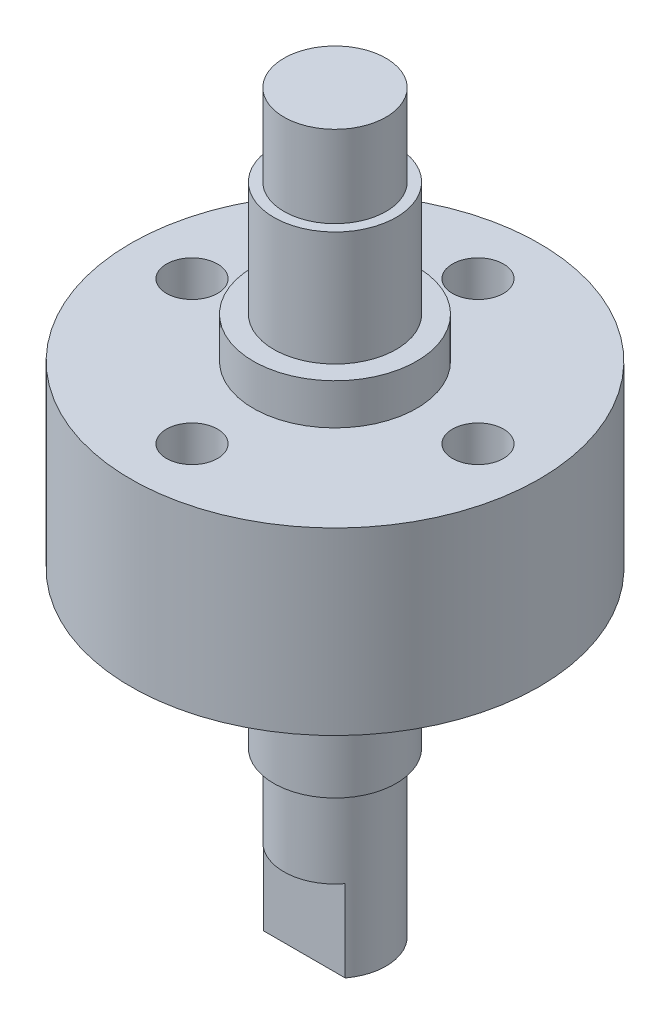
ISO-10303-21;
HEADER;
FILE_DESCRIPTION(('STEP AP214'),'2;1');
FILE_NAME('part.step','',(''),(''),'','','');
FILE_SCHEMA(('AUTOMOTIVE_DESIGN { 1 0 10303 214 1 1 1 1 }'));
ENDSEC;
DATA;
#1=APPLICATION_CONTEXT('core data for automotive mechanical design processes');
#2=APPLICATION_PROTOCOL_DEFINITION('international standard','automotive_design',2000,#1);
#3=PRODUCT_CONTEXT('',#1,'mechanical');
#4=PRODUCT('Part','Part','',(#3));
#5=PRODUCT_RELATED_PRODUCT_CATEGORY('part','',(#4));
#6=PRODUCT_DEFINITION_FORMATION('','',#4);
#7=PRODUCT_DEFINITION_CONTEXT('part definition',#1,'design');
#8=PRODUCT_DEFINITION('design','',#6,#7);
#9=PRODUCT_DEFINITION_SHAPE('','',#8);
#10=(LENGTH_UNIT() NAMED_UNIT(*) SI_UNIT(.MILLI.,.METRE.));
#11=(NAMED_UNIT(*) PLANE_ANGLE_UNIT() SI_UNIT($,.RADIAN.));
#12=(NAMED_UNIT(*) SI_UNIT($,.STERADIAN.) SOLID_ANGLE_UNIT());
#13=UNCERTAINTY_MEASURE_WITH_UNIT(LENGTH_MEASURE(1.E-05),#10,'distance_accuracy_value','');
#14=(GEOMETRIC_REPRESENTATION_CONTEXT(3) GLOBAL_UNCERTAINTY_ASSIGNED_CONTEXT((#13)) GLOBAL_UNIT_ASSIGNED_CONTEXT((#10,
#11,#12)) REPRESENTATION_CONTEXT('',''));
#15=CARTESIAN_POINT('',(0.,0.,0.));
#16=DIRECTION('',(0.,0.,1.));
#17=DIRECTION('',(1.,0.,0.));
#18=AXIS2_PLACEMENT_3D('',#15,#16,#17);
#19=CARTESIAN_POINT('',(2.21364849368684,9.97796080302989,0.));
#20=DIRECTION('',(0.,1.,0.));
#21=DIRECTION('',(-1.,0.,0.));
#22=AXIS2_PLACEMENT_3D('',#19,#20,#21);
#23=PLANE('',#22);
#24=CARTESIAN_POINT('',(-8.78635150621403,9.97796080302989,0.));
#25=DIRECTION('',(0.,-1.,0.));
#26=DIRECTION('',(0.,0.,-1.));
#27=AXIS2_PLACEMENT_3D('',#24,#25,#26);
#28=CIRCLE('',#27,1.25);
#29=CARTESIAN_POINT('',(-8.78635150621403,9.97796080302989,-1.24999999999993));
#30=VERTEX_POINT('',#29);
#31=EDGE_CURVE('E116',#30,#30,#28,.T.);
#32=ORIENTED_EDGE('',*,*,#31,.F.);
#33=EDGE_LOOP('',(#32));
#34=FACE_BOUND('',#33,.T.);
#35=CARTESIAN_POINT('',(-1.78635150621403,9.97796080302989,-7.));
#36=DIRECTION('',(0.,-1.,0.));
#37=DIRECTION('',(0.,0.,-1.));
#38=AXIS2_PLACEMENT_3D('',#35,#36,#37);
#39=CIRCLE('',#38,1.25);
#40=CARTESIAN_POINT('',(-1.78635150621403,9.97796080302989,-8.25));
#41=VERTEX_POINT('',#40);
#42=EDGE_CURVE('E115',#41,#41,#39,.T.);
#43=ORIENTED_EDGE('',*,*,#42,.F.);
#44=EDGE_LOOP('',(#43));
#45=FACE_BOUND('',#44,.T.);
#46=CARTESIAN_POINT('',(5.21364849378598,9.97796080302989,0.));
#47=DIRECTION('',(0.,-1.,0.));
#48=DIRECTION('',(0.,0.,-1.));
#49=AXIS2_PLACEMENT_3D('',#46,#47,#48);
#50=CIRCLE('',#49,1.25);
#51=CARTESIAN_POINT('',(5.21364849378598,9.97796080302989,-1.25000000000002));
#52=VERTEX_POINT('',#51);
#53=EDGE_CURVE('E112',#52,#52,#50,.T.);
#54=ORIENTED_EDGE('',*,*,#53,.F.);
#55=EDGE_LOOP('',(#54));
#56=FACE_BOUND('',#55,.T.);
#57=CARTESIAN_POINT('',(-1.78635150621402,9.97796080302989,0.));
#58=DIRECTION('',(0.,1.,0.));
#59=DIRECTION('',(-1.,0.,0.));
#60=AXIS2_PLACEMENT_3D('',#57,#58,#59);
#61=CIRCLE('',#60,10.0000000000246);
#62=CARTESIAN_POINT('',(-11.7863515062386,9.97796080302989,0.));
#63=VERTEX_POINT('',#62);
#64=EDGE_CURVE('E43',#63,#63,#61,.T.);
#65=ORIENTED_EDGE('',*,*,#64,.F.);
#66=EDGE_LOOP('',(#65));
#67=FACE_BOUND('',#66,.T.);
#68=CARTESIAN_POINT('',(-1.78635150621402,9.97796080302989,0.));
#69=DIRECTION('',(0.,1.,0.));
#70=DIRECTION('',(-1.,0.,0.));
#71=AXIS2_PLACEMENT_3D('',#68,#69,#70);
#72=CIRCLE('',#71,3.99999999990087);
#73=CARTESIAN_POINT('',(-5.78635150611489,9.97796080302989,0.));
#74=VERTEX_POINT('',#73);
#75=EDGE_CURVE('E108',#74,#74,#72,.T.);
#76=ORIENTED_EDGE('',*,*,#75,.T.);
#77=EDGE_LOOP('',(#76));
#78=FACE_BOUND('',#77,.T.);
#79=CARTESIAN_POINT('',(-1.78635150621402,9.97796080302989,7.));
#80=DIRECTION('',(0.,-1.,0.));
#81=DIRECTION('',(0.,0.,-1.));
#82=AXIS2_PLACEMENT_3D('',#79,#80,#81);
#83=CIRCLE('',#82,1.25);
#84=CARTESIAN_POINT('',(-1.78635150621402,9.97796080302989,5.75));
#85=VERTEX_POINT('',#84);
#86=EDGE_CURVE('E109',#85,#85,#83,.T.);
#87=ORIENTED_EDGE('',*,*,#86,.F.);
#88=EDGE_LOOP('',(#87));
#89=FACE_BOUND('',#88,.T.);
#90=ADVANCED_FACE('F36',(#34,#45,#56,#67,#78,#89),#23,.F.);
#91=CARTESIAN_POINT('',(-1.78635150621403,30.3779608030246,0.));
#92=DIRECTION('',(0.,1.,0.));
#93=DIRECTION('',(-1.,0.,0.));
#94=AXIS2_PLACEMENT_3D('',#91,#92,#93);
#95=CYLINDRICAL_SURFACE('',#94,10.0000000000246);
#96=CARTESIAN_POINT('',(-1.78635150621403,18.7779608029697,0.));
#97=DIRECTION('',(0.,1.,0.));
#98=DIRECTION('',(-1.,0.,0.));
#99=AXIS2_PLACEMENT_3D('',#96,#97,#98);
#100=CIRCLE('',#99,10.0000000000246);
#101=CARTESIAN_POINT('',(-11.7863515062386,18.7779608029697,0.));
#102=VERTEX_POINT('',#101);
#103=EDGE_CURVE('E100',#102,#102,#100,.T.);
#104=ORIENTED_EDGE('',*,*,#103,.F.);
#105=EDGE_LOOP('',(#104));
#106=FACE_BOUND('',#105,.T.);
#107=ORIENTED_EDGE('',*,*,#64,.T.);
#108=EDGE_LOOP('',(#107));
#109=FACE_BOUND('',#108,.T.);
#110=ADVANCED_FACE('F159',(#106,#109),#95,.T.);
#111=CARTESIAN_POINT('',(2.2136484937978,18.7779608029697,0.));
#112=DIRECTION('',(0.,-1.,0.));
#113=DIRECTION('',(1.,0.,0.));
#114=AXIS2_PLACEMENT_3D('',#111,#112,#113);
#115=PLANE('',#114);
#116=CARTESIAN_POINT('',(-8.78635150621403,18.7779608029697,0.));
#117=DIRECTION('',(0.,-1.,0.));
#118=DIRECTION('',(1.,0.,0.));
#119=AXIS2_PLACEMENT_3D('',#116,#117,#118);
#120=CIRCLE('',#119,1.25);
#121=CARTESIAN_POINT('',(-7.53635150621403,18.7779608029697,0.));
#122=VERTEX_POINT('',#121);
#123=EDGE_CURVE('E113',#122,#122,#120,.T.);
#124=ORIENTED_EDGE('',*,*,#123,.T.);
#125=EDGE_LOOP('',(#124));
#126=FACE_BOUND('',#125,.T.);
#127=CARTESIAN_POINT('',(-1.78635150621403,18.7779608029697,-7.));
#128=DIRECTION('',(0.,-1.,0.));
#129=DIRECTION('',(1.,0.,0.));
#130=AXIS2_PLACEMENT_3D('',#127,#128,#129);
#131=CIRCLE('',#130,1.25);
#132=CARTESIAN_POINT('',(-0.536351506214027,18.7779608029697,-7.));
#133=VERTEX_POINT('',#132);
#134=EDGE_CURVE('E120',#133,#133,#131,.T.);
#135=ORIENTED_EDGE('',*,*,#134,.T.);
#136=EDGE_LOOP('',(#135));
#137=FACE_BOUND('',#136,.T.);
#138=CARTESIAN_POINT('',(5.21364849378598,18.7779608029697,0.));
#139=DIRECTION('',(0.,-1.,0.));
#140=DIRECTION('',(1.,0.,0.));
#141=AXIS2_PLACEMENT_3D('',#138,#139,#140);
#142=CIRCLE('',#141,1.25);
#143=CARTESIAN_POINT('',(6.46364849378597,18.7779608029697,0.));
#144=VERTEX_POINT('',#143);
#145=EDGE_CURVE('E110',#144,#144,#142,.T.);
#146=ORIENTED_EDGE('',*,*,#145,.T.);
#147=EDGE_LOOP('',(#146));
#148=FACE_BOUND('',#147,.T.);
#149=CARTESIAN_POINT('',(-1.78635150621402,18.7779608029697,7.));
#150=DIRECTION('',(0.,-1.,0.));
#151=DIRECTION('',(1.,0.,0.));
#152=AXIS2_PLACEMENT_3D('',#149,#150,#151);
#153=CIRCLE('',#152,1.25);
#154=CARTESIAN_POINT('',(-0.536351506214026,18.7779608029697,7.));
#155=VERTEX_POINT('',#154);
#156=EDGE_CURVE('E105',#155,#155,#153,.T.);
#157=ORIENTED_EDGE('',*,*,#156,.T.);
#158=EDGE_LOOP('',(#157));
#159=FACE_BOUND('',#158,.T.);
#160=CARTESIAN_POINT('',(-1.78635150621403,18.7779608029697,0.));
#161=DIRECTION('',(0.,1.,0.));
#162=DIRECTION('',(-1.,0.,0.));
#163=AXIS2_PLACEMENT_3D('',#160,#161,#162);
#164=CIRCLE('',#163,4.00000000001183);
#165=CARTESIAN_POINT('',(-5.78635150622585,18.7779608029697,0.));
#166=VERTEX_POINT('',#165);
#167=EDGE_CURVE('E97',#166,#166,#164,.T.);
#168=ORIENTED_EDGE('',*,*,#167,.F.);
#169=EDGE_LOOP('',(#168));
#170=FACE_BOUND('',#169,.T.);
#171=ORIENTED_EDGE('',*,*,#103,.T.);
#172=EDGE_LOOP('',(#171));
#173=FACE_BOUND('',#172,.T.);
#174=ADVANCED_FACE('F164',(#126,#137,#148,#159,#170,#173),#115,.F.);
#175=CARTESIAN_POINT('',(-1.78635150621403,30.3779608030246,0.));
#176=DIRECTION('',(0.,1.,0.));
#177=DIRECTION('',(-1.,0.,0.));
#178=AXIS2_PLACEMENT_3D('',#175,#176,#177);
#179=CYLINDRICAL_SURFACE('',#178,4.00000000001183);
#180=CARTESIAN_POINT('',(-1.78635150621403,20.7779608029638,0.));
#181=DIRECTION('',(0.,1.,0.));
#182=DIRECTION('',(-1.,0.,0.));
#183=AXIS2_PLACEMENT_3D('',#180,#181,#182);
#184=CIRCLE('',#183,4.00000000001183);
#185=CARTESIAN_POINT('',(-5.78635150622585,20.7779608029638,0.));
#186=VERTEX_POINT('',#185);
#187=EDGE_CURVE('E94',#186,#186,#184,.T.);
#188=ORIENTED_EDGE('',*,*,#187,.F.);
#189=EDGE_LOOP('',(#188));
#190=FACE_BOUND('',#189,.T.);
#191=ORIENTED_EDGE('',*,*,#167,.T.);
#192=EDGE_LOOP('',(#191));
#193=FACE_BOUND('',#192,.T.);
#194=ADVANCED_FACE('F187',(#190,#193),#179,.T.);
#195=CARTESIAN_POINT('',(1.21364849379598,20.7779608029638,0.));
#196=DIRECTION('',(0.,-1.,0.));
#197=DIRECTION('',(1.,0.,0.));
#198=AXIS2_PLACEMENT_3D('',#195,#196,#197);
#199=PLANE('',#198);
#200=CARTESIAN_POINT('',(-1.78635150621403,20.7779608029638,0.));
#201=DIRECTION('',(0.,1.,0.));
#202=DIRECTION('',(-1.,0.,0.));
#203=AXIS2_PLACEMENT_3D('',#200,#201,#202);
#204=CIRCLE('',#203,3.00000000001001);
#205=CARTESIAN_POINT('',(-4.78635150622403,20.7779608029638,0.));
#206=VERTEX_POINT('',#205);
#207=EDGE_CURVE('E91',#206,#206,#204,.T.);
#208=ORIENTED_EDGE('',*,*,#207,.F.);
#209=EDGE_LOOP('',(#208));
#210=FACE_BOUND('',#209,.T.);
#211=ORIENTED_EDGE('',*,*,#187,.T.);
#212=EDGE_LOOP('',(#211));
#213=FACE_BOUND('',#212,.T.);
#214=ADVANCED_FACE('F195',(#210,#213),#199,.F.);
#215=CARTESIAN_POINT('',(-1.78635150621403,30.3779608030246,0.));
#216=DIRECTION('',(0.,1.,0.));
#217=DIRECTION('',(-1.,0.,0.));
#218=AXIS2_PLACEMENT_3D('',#215,#216,#217);
#219=CYLINDRICAL_SURFACE('',#218,3.00000000001001);
#220=CARTESIAN_POINT('',(-1.78635150621403,26.3779608030237,0.));
#221=DIRECTION('',(0.,1.,0.));
#222=DIRECTION('',(-1.,0.,0.));
#223=AXIS2_PLACEMENT_3D('',#220,#221,#222);
#224=CIRCLE('',#223,3.00000000001001);
#225=CARTESIAN_POINT('',(-4.78635150622403,26.3779608030237,0.));
#226=VERTEX_POINT('',#225);
#227=EDGE_CURVE('E88',#226,#226,#224,.T.);
#228=ORIENTED_EDGE('',*,*,#227,.F.);
#229=EDGE_LOOP('',(#228));
#230=FACE_BOUND('',#229,.T.);
#231=ORIENTED_EDGE('',*,*,#207,.T.);
#232=EDGE_LOOP('',(#231));
#233=FACE_BOUND('',#232,.T.);
#234=ADVANCED_FACE('F201',(#230,#233),#219,.T.);
#235=CARTESIAN_POINT('',(0.713648493788705,26.3779608030237,0.));
#236=DIRECTION('',(0.,-1.,0.));
#237=DIRECTION('',(1.,0.,0.));
#238=AXIS2_PLACEMENT_3D('',#235,#236,#237);
#239=PLANE('',#238);
#240=CARTESIAN_POINT('',(-1.78635150621403,26.3779608030237,0.));
#241=DIRECTION('',(0.,1.,0.));
#242=DIRECTION('',(-1.,0.,0.));
#243=AXIS2_PLACEMENT_3D('',#240,#241,#242);
#244=CIRCLE('',#243,2.50000000000273);
#245=CARTESIAN_POINT('',(-4.28635150621676,26.3779608030237,0.));
#246=VERTEX_POINT('',#245);
#247=EDGE_CURVE('E79',#246,#246,#244,.T.);
#248=ORIENTED_EDGE('',*,*,#247,.F.);
#249=EDGE_LOOP('',(#248));
#250=FACE_BOUND('',#249,.T.);
#251=ORIENTED_EDGE('',*,*,#227,.T.);
#252=EDGE_LOOP('',(#251));
#253=FACE_BOUND('',#252,.T.);
#254=ADVANCED_FACE('F208',(#250,#253),#239,.F.);
#255=CARTESIAN_POINT('',(-1.78635150621403,30.3779608030246,0.));
#256=DIRECTION('',(0.,1.,0.));
#257=DIRECTION('',(-1.,0.,0.));
#258=AXIS2_PLACEMENT_3D('',#255,#256,#257);
#259=CYLINDRICAL_SURFACE('',#258,2.50000000000273);
#260=CARTESIAN_POINT('',(-1.78635150621403,30.3779608030246,0.));
#261=DIRECTION('',(0.,1.,0.));
#262=DIRECTION('',(-1.,0.,0.));
#263=AXIS2_PLACEMENT_3D('',#260,#261,#262);
#264=CIRCLE('',#263,2.50000000000273);
#265=CARTESIAN_POINT('',(-4.28635150621676,30.3779608030246,0.));
#266=VERTEX_POINT('',#265);
#267=EDGE_CURVE('E75',#266,#266,#264,.T.);
#268=ORIENTED_EDGE('',*,*,#267,.F.);
#269=EDGE_LOOP('',(#268));
#270=FACE_BOUND('',#269,.T.);
#271=ORIENTED_EDGE('',*,*,#247,.T.);
#272=EDGE_LOOP('',(#271));
#273=FACE_BOUND('',#272,.T.);
#274=ADVANCED_FACE('F212',(#270,#273),#259,.T.);
#275=CARTESIAN_POINT('',(-1.78635150621403,30.3779608030246,0.));
#276=DIRECTION('',(0.,-1.,0.));
#277=DIRECTION('',(1.,0.,0.));
#278=AXIS2_PLACEMENT_3D('',#275,#276,#277);
#279=PLANE('',#278);
#280=ORIENTED_EDGE('',*,*,#267,.T.);
#281=EDGE_LOOP('',(#280));
#282=FACE_BOUND('',#281,.T.);
#283=ADVANCED_FACE('F156',(#282),#279,.F.);
#284=CARTESIAN_POINT('',(-1.78635150621402,-5.62203919697574,0.));
#285=DIRECTION('',(0.,1.,0.));
#286=DIRECTION('',(-1.,0.,0.));
#287=AXIS2_PLACEMENT_3D('',#284,#285,#286);
#288=PLANE('',#287);
#289=CARTESIAN_POINT('',(-1.78635150621402,-5.62203919697574,0.));
#290=DIRECTION('',(0.,1.,0.));
#291=DIRECTION('',(-1.,0.,0.));
#292=AXIS2_PLACEMENT_3D('',#289,#290,#291);
#293=CIRCLE('',#292,2.50000000003183);
#294=CARTESIAN_POINT('',(0.213648493825768,-5.62203919697574,1.5));
#295=VERTEX_POINT('',#294);
#296=CARTESIAN_POINT('',(-3.78635150625381,-5.62203919697574,1.5));
#297=VERTEX_POINT('',#296);
#298=EDGE_CURVE('E71',#295,#297,#293,.T.);
#299=ORIENTED_EDGE('',*,*,#298,.F.);
#300=DIRECTION('',(1.,0.,0.));
#301=VECTOR('',#300,1.);
#302=CARTESIAN_POINT('',(-3.78635150625381,-5.62203919697574,1.5));
#303=LINE('',#302,#301);
#304=EDGE_CURVE('E62',#297,#295,#303,.T.);
#305=ORIENTED_EDGE('',*,*,#304,.F.);
#306=EDGE_LOOP('',(#299,#305));
#307=FACE_BOUND('',#306,.T.);
#308=ADVANCED_FACE('F70',(#307),#288,.F.);
#309=CARTESIAN_POINT('',(-1.78635150621403,30.3779608030246,0.));
#310=DIRECTION('',(0.,1.,0.));
#311=DIRECTION('',(-1.,0.,0.));
#312=AXIS2_PLACEMENT_3D('',#309,#310,#311);
#313=CYLINDRICAL_SURFACE('',#312,2.50000000003183);
#314=ORIENTED_EDGE('',*,*,#298,.T.);
#315=DIRECTION('',(0.,-1.,0.));
#316=VECTOR('',#315,1.);
#317=CARTESIAN_POINT('',(-3.78635150625381,-1.62203919697574,1.5));
#318=LINE('',#317,#316);
#319=CARTESIAN_POINT('',(-3.78635150625381,-1.62203919697574,1.5));
#320=VERTEX_POINT('',#319);
#321=EDGE_CURVE('E59',#320,#297,#318,.T.);
#322=ORIENTED_EDGE('',*,*,#321,.F.);
#323=CARTESIAN_POINT('',(-1.78635150621402,-1.62203919697573,0.));
#324=DIRECTION('',(0.,1.,0.));
#325=DIRECTION('',(-1.,0.,0.));
#326=AXIS2_PLACEMENT_3D('',#323,#324,#325);
#327=CIRCLE('',#326,2.50000000003183);
#328=CARTESIAN_POINT('',(0.213648493825768,-1.62203919697573,1.5));
#329=VERTEX_POINT('',#328);
#330=EDGE_CURVE('E11',#320,#329,#327,.T.);
#331=ORIENTED_EDGE('',*,*,#330,.T.);
#332=DIRECTION('',(0.,-1.,0.));
#333=VECTOR('',#332,1.);
#334=CARTESIAN_POINT('',(0.213648493825768,-1.62203919697573,1.5));
#335=LINE('',#334,#333);
#336=EDGE_CURVE('E66',#329,#295,#335,.T.);
#337=ORIENTED_EDGE('',*,*,#336,.T.);
#338=EDGE_LOOP('',(#314,#322,#331,#337));
#339=FACE_BOUND('',#338,.T.);
#340=CARTESIAN_POINT('',(-1.78635150621402,2.37796080302426,0.));
#341=DIRECTION('',(0.,1.,0.));
#342=DIRECTION('',(-1.,0.,0.));
#343=AXIS2_PLACEMENT_3D('',#340,#341,#342);
#344=CIRCLE('',#343,2.50000000003183);
#345=CARTESIAN_POINT('',(-4.28635150624585,2.37796080302426,0.));
#346=VERTEX_POINT('',#345);
#347=EDGE_CURVE('E76',#346,#346,#344,.T.);
#348=ORIENTED_EDGE('',*,*,#347,.F.);
#349=EDGE_LOOP('',(#348));
#350=FACE_BOUND('',#349,.T.);
#351=ADVANCED_FACE('F73',(#339,#350),#313,.T.);
#352=CARTESIAN_POINT('',(0.713648493817809,2.37796080302427,0.));
#353=DIRECTION('',(0.,1.,0.));
#354=DIRECTION('',(-1.,0.,0.));
#355=AXIS2_PLACEMENT_3D('',#352,#353,#354);
#356=PLANE('',#355);
#357=CARTESIAN_POINT('',(-1.78635150621402,2.37796080302426,0.));
#358=DIRECTION('',(0.,1.,0.));
#359=DIRECTION('',(-1.,0.,0.));
#360=AXIS2_PLACEMENT_3D('',#357,#358,#359);
#361=CIRCLE('',#360,3.00000000002456);
#362=CARTESIAN_POINT('',(-4.78635150623858,2.37796080302426,0.));
#363=VERTEX_POINT('',#362);
#364=EDGE_CURVE('E82',#363,#363,#361,.T.);
#365=ORIENTED_EDGE('',*,*,#364,.F.);
#366=EDGE_LOOP('',(#365));
#367=FACE_BOUND('',#366,.T.);
#368=ORIENTED_EDGE('',*,*,#347,.T.);
#369=EDGE_LOOP('',(#368));
#370=FACE_BOUND('',#369,.T.);
#371=ADVANCED_FACE('F146',(#367,#370),#356,.F.);
#372=CARTESIAN_POINT('',(-1.78635150621403,30.3779608030246,0.));
#373=DIRECTION('',(0.,1.,0.));
#374=DIRECTION('',(-1.,0.,0.));
#375=AXIS2_PLACEMENT_3D('',#372,#373,#374);
#376=CYLINDRICAL_SURFACE('',#375,3.00000000002456);
#377=CARTESIAN_POINT('',(-1.78635150621402,7.97796080303441,0.));
#378=DIRECTION('',(0.,1.,0.));
#379=DIRECTION('',(-1.,0.,0.));
#380=AXIS2_PLACEMENT_3D('',#377,#378,#379);
#381=CIRCLE('',#380,3.00000000002456);
#382=CARTESIAN_POINT('',(-4.78635150623858,7.97796080303441,0.));
#383=VERTEX_POINT('',#382);
#384=EDGE_CURVE('E139',#383,#383,#381,.T.);
#385=ORIENTED_EDGE('',*,*,#384,.F.);
#386=EDGE_LOOP('',(#385));
#387=FACE_BOUND('',#386,.T.);
#388=ORIENTED_EDGE('',*,*,#364,.T.);
#389=EDGE_LOOP('',(#388));
#390=FACE_BOUND('',#389,.T.);
#391=ADVANCED_FACE('F144',(#387,#390),#376,.T.);
#392=CARTESIAN_POINT('',(1.21364849381053,7.97796080303441,0.));
#393=DIRECTION('',(0.,1.,0.));
#394=DIRECTION('',(-1.,0.,0.));
#395=AXIS2_PLACEMENT_3D('',#392,#393,#394);
#396=PLANE('',#395);
#397=CARTESIAN_POINT('',(-1.78635150621402,7.97796080303441,0.));
#398=DIRECTION('',(0.,1.,0.));
#399=DIRECTION('',(-1.,0.,0.));
#400=AXIS2_PLACEMENT_3D('',#397,#398,#399);
#401=CIRCLE('',#400,3.99999999990087);
#402=CARTESIAN_POINT('',(-5.78635150611489,7.97796080303441,0.));
#403=VERTEX_POINT('',#402);
#404=EDGE_CURVE('E136',#403,#403,#401,.T.);
#405=ORIENTED_EDGE('',*,*,#404,.F.);
#406=EDGE_LOOP('',(#405));
#407=FACE_BOUND('',#406,.T.);
#408=ORIENTED_EDGE('',*,*,#384,.T.);
#409=EDGE_LOOP('',(#408));
#410=FACE_BOUND('',#409,.T.);
#411=ADVANCED_FACE('F280',(#407,#410),#396,.F.);
#412=CARTESIAN_POINT('',(-1.78635150621403,30.3779608030246,0.));
#413=DIRECTION('',(0.,1.,0.));
#414=DIRECTION('',(-1.,0.,0.));
#415=AXIS2_PLACEMENT_3D('',#412,#413,#414);
#416=CYLINDRICAL_SURFACE('',#415,3.99999999990087);
#417=ORIENTED_EDGE('',*,*,#75,.F.);
#418=EDGE_LOOP('',(#417));
#419=FACE_BOUND('',#418,.T.);
#420=ORIENTED_EDGE('',*,*,#404,.T.);
#421=EDGE_LOOP('',(#420));
#422=FACE_BOUND('',#421,.T.);
#423=ADVANCED_FACE('F181',(#419,#422),#416,.T.);
#424=CARTESIAN_POINT('',(-1.78635150621402,9.97796080302989,7.));
#425=DIRECTION('',(0.,-1.,0.));
#426=DIRECTION('',(0.,0.,-1.));
#427=AXIS2_PLACEMENT_3D('',#424,#425,#426);
#428=CYLINDRICAL_SURFACE('',#427,1.25);
#429=ORIENTED_EDGE('',*,*,#86,.T.);
#430=EDGE_LOOP('',(#429));
#431=FACE_BOUND('',#430,.T.);
#432=ORIENTED_EDGE('',*,*,#156,.F.);
#433=EDGE_LOOP('',(#432));
#434=FACE_BOUND('',#433,.T.);
#435=ADVANCED_FACE('F177',(#431,#434),#428,.F.);
#436=CARTESIAN_POINT('',(5.21364849378598,9.97796080302989,0.));
#437=DIRECTION('',(0.,-1.,0.));
#438=DIRECTION('',(0.,0.,-1.));
#439=AXIS2_PLACEMENT_3D('',#436,#437,#438);
#440=CYLINDRICAL_SURFACE('',#439,1.25);
#441=ORIENTED_EDGE('',*,*,#53,.T.);
#442=EDGE_LOOP('',(#441));
#443=FACE_BOUND('',#442,.T.);
#444=ORIENTED_EDGE('',*,*,#145,.F.);
#445=EDGE_LOOP('',(#444));
#446=FACE_BOUND('',#445,.T.);
#447=ADVANCED_FACE('F180',(#443,#446),#440,.F.);
#448=CARTESIAN_POINT('',(-1.78635150621403,9.97796080302989,-7.));
#449=DIRECTION('',(0.,-1.,0.));
#450=DIRECTION('',(0.,0.,-1.));
#451=AXIS2_PLACEMENT_3D('',#448,#449,#450);
#452=CYLINDRICAL_SURFACE('',#451,1.25);
#453=ORIENTED_EDGE('',*,*,#42,.T.);
#454=EDGE_LOOP('',(#453));
#455=FACE_BOUND('',#454,.T.);
#456=ORIENTED_EDGE('',*,*,#134,.F.);
#457=EDGE_LOOP('',(#456));
#458=FACE_BOUND('',#457,.T.);
#459=ADVANCED_FACE('F271',(#455,#458),#452,.F.);
#460=CARTESIAN_POINT('',(-8.78635150621403,9.97796080302989,0.));
#461=DIRECTION('',(0.,-1.,0.));
#462=DIRECTION('',(0.,0.,-1.));
#463=AXIS2_PLACEMENT_3D('',#460,#461,#462);
#464=CYLINDRICAL_SURFACE('',#463,1.25);
#465=ORIENTED_EDGE('',*,*,#31,.T.);
#466=EDGE_LOOP('',(#465));
#467=FACE_BOUND('',#466,.T.);
#468=ORIENTED_EDGE('',*,*,#123,.F.);
#469=EDGE_LOOP('',(#468));
#470=FACE_BOUND('',#469,.T.);
#471=ADVANCED_FACE('F242',(#467,#470),#464,.F.);
#472=CARTESIAN_POINT('',(0.,-1.62203919697573,0.));
#473=DIRECTION('',(0.,1.,0.));
#474=DIRECTION('',(-1.,0.,0.));
#475=AXIS2_PLACEMENT_3D('',#472,#473,#474);
#476=PLANE('',#475);
#477=DIRECTION('',(1.,0.,0.));
#478=VECTOR('',#477,1.);
#479=CARTESIAN_POINT('',(-3.78635150625381,-1.62203919697574,1.5));
#480=LINE('',#479,#478);
#481=EDGE_CURVE('E49',#320,#329,#480,.T.);
#482=ORIENTED_EDGE('',*,*,#481,.T.);
#483=ORIENTED_EDGE('',*,*,#330,.F.);
#484=EDGE_LOOP('',(#482,#483));
#485=FACE_BOUND('',#484,.T.);
#486=ADVANCED_FACE('F252',(#485),#476,.F.);
#487=CARTESIAN_POINT('',(-3.78635150625381,-1.62203919697574,1.5));
#488=DIRECTION('',(0.,0.,-1.));
#489=DIRECTION('',(-1.,0.,0.));
#490=AXIS2_PLACEMENT_3D('',#487,#488,#489);
#491=PLANE('',#490);
#492=ORIENTED_EDGE('',*,*,#304,.T.);
#493=ORIENTED_EDGE('',*,*,#336,.F.);
#494=ORIENTED_EDGE('',*,*,#481,.F.);
#495=ORIENTED_EDGE('',*,*,#321,.T.);
#496=EDGE_LOOP('',(#492,#493,#494,#495));
#497=FACE_BOUND('',#496,.T.);
#498=ADVANCED_FACE('F61',(#497),#491,.F.);
#499=CLOSED_SHELL('',(#90,#110,#174,#194,#214,#234,#254,#274,#283,#308,#351,#371,#391,#411,#423,
#435,#447,#459,#471,#486,#498));
#500=MANIFOLD_SOLID_BREP('B2',#499);
#501=ADVANCED_BREP_SHAPE_REPRESENTATION('',(#18,#500),#14);
#502=SHAPE_DEFINITION_REPRESENTATION(#9,#501);
ENDSEC;
END-ISO-10303-21;
